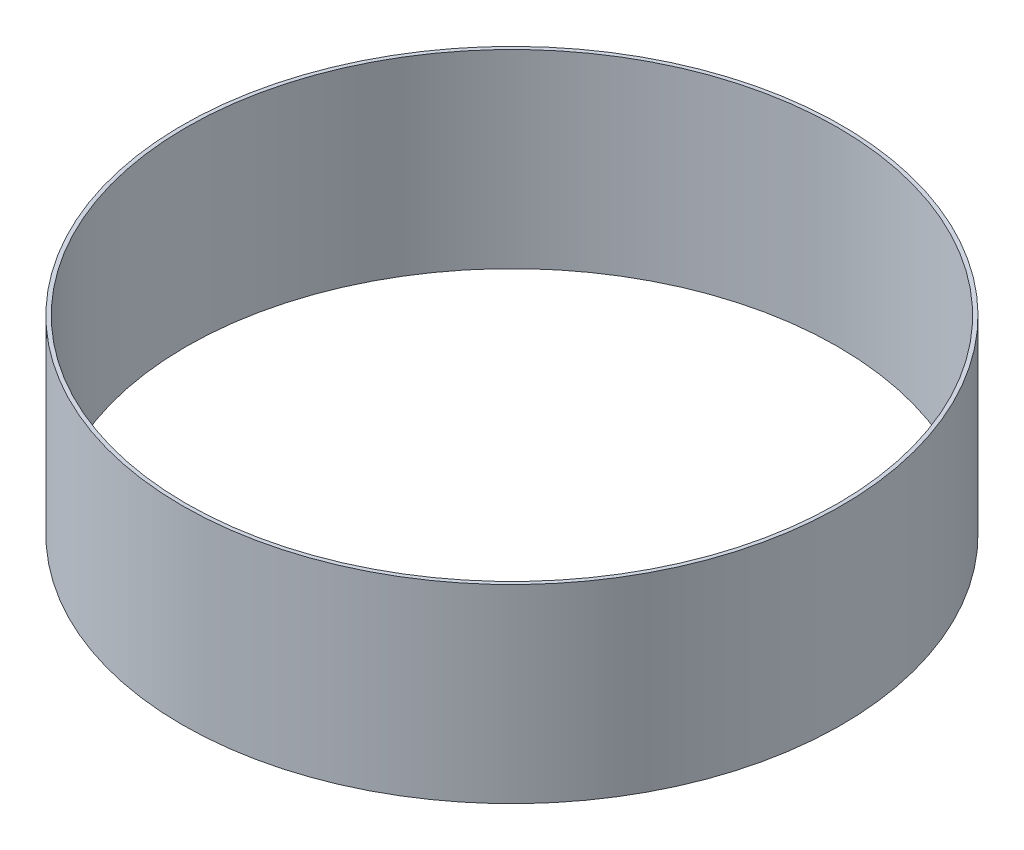
ISO-10303-21;
HEADER;
FILE_DESCRIPTION(('STEP AP214'),'2;1');
FILE_NAME('part.step','',(''),(''),'','','');
FILE_SCHEMA(('AUTOMOTIVE_DESIGN { 1 0 10303 214 1 1 1 1 }'));
ENDSEC;
DATA;
#1=APPLICATION_CONTEXT('core data for automotive mechanical design processes');
#2=APPLICATION_PROTOCOL_DEFINITION('international standard','automotive_design',2000,#1);
#3=PRODUCT_CONTEXT('',#1,'mechanical');
#4=PRODUCT('Part','Part','',(#3));
#5=PRODUCT_RELATED_PRODUCT_CATEGORY('part','',(#4));
#6=PRODUCT_DEFINITION_FORMATION('','',#4);
#7=PRODUCT_DEFINITION_CONTEXT('part definition',#1,'design');
#8=PRODUCT_DEFINITION('design','',#6,#7);
#9=PRODUCT_DEFINITION_SHAPE('','',#8);
#10=(LENGTH_UNIT() NAMED_UNIT(*) SI_UNIT(.MILLI.,.METRE.));
#11=(NAMED_UNIT(*) PLANE_ANGLE_UNIT() SI_UNIT($,.RADIAN.));
#12=(NAMED_UNIT(*) SI_UNIT($,.STERADIAN.) SOLID_ANGLE_UNIT());
#13=UNCERTAINTY_MEASURE_WITH_UNIT(LENGTH_MEASURE(1.E-05),#10,'distance_accuracy_value','');
#14=(GEOMETRIC_REPRESENTATION_CONTEXT(3) GLOBAL_UNCERTAINTY_ASSIGNED_CONTEXT((#13)) GLOBAL_UNIT_ASSIGNED_CONTEXT((#10,
#11,#12)) REPRESENTATION_CONTEXT('',''));
#15=CARTESIAN_POINT('',(0.,0.,0.));
#16=DIRECTION('',(0.,0.,1.));
#17=DIRECTION('',(1.,0.,0.));
#18=AXIS2_PLACEMENT_3D('',#15,#16,#17);
#19=CARTESIAN_POINT('',(130.81,76.2,0.));
#20=DIRECTION('',(0.,1.,0.));
#21=DIRECTION('',(0.,0.,1.));
#22=AXIS2_PLACEMENT_3D('',#19,#20,#21);
#23=PLANE('',#22);
#24=CARTESIAN_POINT('',(0.,76.2,0.));
#25=DIRECTION('',(0.,1.,0.));
#26=DIRECTION('',(0.,0.,1.));
#27=AXIS2_PLACEMENT_3D('',#24,#25,#26);
#28=CIRCLE('',#27,132.334);
#29=CARTESIAN_POINT('',(0.,76.2,132.334));
#30=VERTEX_POINT('',#29);
#31=EDGE_CURVE('E10',#30,#30,#28,.T.);
#32=ORIENTED_EDGE('',*,*,#31,.T.);
#33=EDGE_LOOP('',(#32));
#34=FACE_BOUND('',#33,.T.);
#35=CARTESIAN_POINT('',(0.,76.2,0.));
#36=DIRECTION('',(0.,1.,0.));
#37=DIRECTION('',(0.,0.,1.));
#38=AXIS2_PLACEMENT_3D('',#35,#36,#37);
#39=CIRCLE('',#38,130.81);
#40=CARTESIAN_POINT('',(0.,76.2,130.81));
#41=VERTEX_POINT('',#40);
#42=EDGE_CURVE('E54',#41,#41,#39,.T.);
#43=ORIENTED_EDGE('',*,*,#42,.F.);
#44=EDGE_LOOP('',(#43));
#45=FACE_BOUND('',#44,.T.);
#46=ADVANCED_FACE('F37',(#34,#45),#23,.T.);
#47=CARTESIAN_POINT('',(0.,91.7467664516127,0.));
#48=DIRECTION('',(0.,1.,0.));
#49=DIRECTION('',(0.,0.,1.));
#50=AXIS2_PLACEMENT_3D('',#47,#48,#49);
#51=CYLINDRICAL_SURFACE('',#50,132.334);
#52=CARTESIAN_POINT('',(0.,0.,0.));
#53=DIRECTION('',(0.,1.,0.));
#54=DIRECTION('',(0.,0.,1.));
#55=AXIS2_PLACEMENT_3D('',#52,#53,#54);
#56=CIRCLE('',#55,132.334);
#57=CARTESIAN_POINT('',(0.,0.,132.334));
#58=VERTEX_POINT('',#57);
#59=EDGE_CURVE('E44',#58,#58,#56,.T.);
#60=ORIENTED_EDGE('',*,*,#59,.T.);
#61=EDGE_LOOP('',(#60));
#62=FACE_BOUND('',#61,.T.);
#63=ORIENTED_EDGE('',*,*,#31,.F.);
#64=EDGE_LOOP('',(#63));
#65=FACE_BOUND('',#64,.T.);
#66=ADVANCED_FACE('F64',(#62,#65),#51,.T.);
#67=CARTESIAN_POINT('',(130.81,0.,0.));
#68=DIRECTION('',(0.,1.,0.));
#69=DIRECTION('',(0.,0.,1.));
#70=AXIS2_PLACEMENT_3D('',#67,#68,#69);
#71=PLANE('',#70);
#72=ORIENTED_EDGE('',*,*,#59,.F.);
#73=EDGE_LOOP('',(#72));
#74=FACE_BOUND('',#73,.T.);
#75=CARTESIAN_POINT('',(0.,0.,0.));
#76=DIRECTION('',(0.,1.,0.));
#77=DIRECTION('',(0.,0.,1.));
#78=AXIS2_PLACEMENT_3D('',#75,#76,#77);
#79=CIRCLE('',#78,130.81);
#80=CARTESIAN_POINT('',(0.,0.,130.81));
#81=VERTEX_POINT('',#80);
#82=EDGE_CURVE('E49',#81,#81,#79,.T.);
#83=ORIENTED_EDGE('',*,*,#82,.T.);
#84=EDGE_LOOP('',(#83));
#85=FACE_BOUND('',#84,.T.);
#86=ADVANCED_FACE('F68',(#74,#85),#71,.F.);
#87=CARTESIAN_POINT('',(0.,91.7467664516127,0.));
#88=DIRECTION('',(0.,1.,0.));
#89=DIRECTION('',(0.,0.,1.));
#90=AXIS2_PLACEMENT_3D('',#87,#88,#89);
#91=CYLINDRICAL_SURFACE('',#90,130.81);
#92=ORIENTED_EDGE('',*,*,#82,.F.);
#93=EDGE_LOOP('',(#92));
#94=FACE_BOUND('',#93,.T.);
#95=ORIENTED_EDGE('',*,*,#42,.T.);
#96=EDGE_LOOP('',(#95));
#97=FACE_BOUND('',#96,.T.);
#98=ADVANCED_FACE('F61',(#94,#97),#91,.F.);
#99=CLOSED_SHELL('',(#46,#66,#86,#98));
#100=MANIFOLD_SOLID_BREP('B2',#99);
#101=ADVANCED_BREP_SHAPE_REPRESENTATION('',(#18,#100),#14);
#102=SHAPE_DEFINITION_REPRESENTATION(#9,#101);
ENDSEC;
END-ISO-10303-21;
